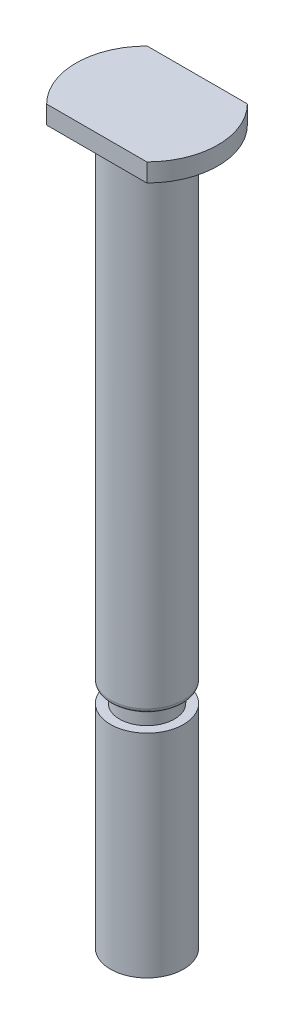
ISO-10303-21;
HEADER;
FILE_DESCRIPTION(('STEP AP214'),'2;1');
FILE_NAME('part.step','',(''),(''),'','','');
FILE_SCHEMA(('AUTOMOTIVE_DESIGN { 1 0 10303 214 1 1 1 1 }'));
ENDSEC;
DATA;
#1=APPLICATION_CONTEXT('core data for automotive mechanical design processes');
#2=APPLICATION_PROTOCOL_DEFINITION('international standard','automotive_design',2000,#1);
#3=PRODUCT_CONTEXT('',#1,'mechanical');
#4=PRODUCT('Part','Part','',(#3));
#5=PRODUCT_RELATED_PRODUCT_CATEGORY('part','',(#4));
#6=PRODUCT_DEFINITION_FORMATION('','',#4);
#7=PRODUCT_DEFINITION_CONTEXT('part definition',#1,'design');
#8=PRODUCT_DEFINITION('design','',#6,#7);
#9=PRODUCT_DEFINITION_SHAPE('','',#8);
#10=(LENGTH_UNIT() NAMED_UNIT(*) SI_UNIT(.MILLI.,.METRE.));
#11=(NAMED_UNIT(*) PLANE_ANGLE_UNIT() SI_UNIT($,.RADIAN.));
#12=(NAMED_UNIT(*) SI_UNIT($,.STERADIAN.) SOLID_ANGLE_UNIT());
#13=UNCERTAINTY_MEASURE_WITH_UNIT(LENGTH_MEASURE(1.E-05),#10,'distance_accuracy_value','');
#14=(GEOMETRIC_REPRESENTATION_CONTEXT(3) GLOBAL_UNCERTAINTY_ASSIGNED_CONTEXT((#13)) GLOBAL_UNIT_ASSIGNED_CONTEXT((#10,
#11,#12)) REPRESENTATION_CONTEXT('',''));
#15=CARTESIAN_POINT('',(0.,0.,0.));
#16=DIRECTION('',(0.,0.,1.));
#17=DIRECTION('',(1.,0.,0.));
#18=AXIS2_PLACEMENT_3D('',#15,#16,#17);
#19=CARTESIAN_POINT('',(0.,160.927319620624,6.));
#20=DIRECTION('',(0.,-1.,0.));
#21=DIRECTION('',(1.,0.,0.));
#22=AXIS2_PLACEMENT_3D('',#19,#20,#21);
#23=CYLINDRICAL_SURFACE('',#22,3.);
#24=DIRECTION('',(0.,1.,0.));
#25=VECTOR('',#24,1.);
#26=CARTESIAN_POINT('',(-3.,160.927319620624,6.));
#27=LINE('',#26,#25);
#28=CARTESIAN_POINT('',(-3.,171.627319620624,6.));
#29=VERTEX_POINT('',#28);
#30=CARTESIAN_POINT('',(-3.,172.927319620624,6.));
#31=VERTEX_POINT('',#30);
#32=EDGE_CURVE('E45',#29,#31,#27,.T.);
#33=ORIENTED_EDGE('',*,*,#32,.F.);
#34=CARTESIAN_POINT('',(0.,171.627319620624,6.));
#35=DIRECTION('',(0.,-1.,0.));
#36=DIRECTION('',(0.,0.,-1.));
#37=AXIS2_PLACEMENT_3D('',#34,#35,#36);
#38=CIRCLE('',#37,3.);
#39=EDGE_CURVE('E40',#29,#29,#38,.F.);
#40=ORIENTED_EDGE('',*,*,#39,.T.);
#41=ORIENTED_EDGE('',*,*,#32,.T.);
#42=CARTESIAN_POINT('',(0.,172.927319620624,6.));
#43=DIRECTION('',(0.,-1.,0.));
#44=DIRECTION('',(0.,0.,-1.));
#45=AXIS2_PLACEMENT_3D('',#42,#43,#44);
#46=CIRCLE('',#45,3.);
#47=CARTESIAN_POINT('',(3.,172.927319620624,6.));
#48=VERTEX_POINT('',#47);
#49=EDGE_CURVE('E133',#31,#48,#46,.T.);
#50=ORIENTED_EDGE('',*,*,#49,.T.);
#51=CARTESIAN_POINT('',(0.,172.927319620624,6.));
#52=DIRECTION('',(0.,-1.,0.));
#53=DIRECTION('',(0.,0.,-1.));
#54=AXIS2_PLACEMENT_3D('',#51,#52,#53);
#55=CIRCLE('',#54,3.);
#56=EDGE_CURVE('E131',#48,#31,#55,.T.);
#57=ORIENTED_EDGE('',*,*,#56,.T.);
#58=EDGE_LOOP('',(#33,#40,#41,#50,#57));
#59=FACE_BOUND('',#58,.T.);
#60=ADVANCED_FACE('F36',(#59),#23,.T.);
#61=CARTESIAN_POINT('',(0.,200.177319620624,6.));
#62=DIRECTION('',(0.,-1.,0.));
#63=DIRECTION('',(1.,0.,0.));
#64=AXIS2_PLACEMENT_3D('',#61,#62,#63);
#65=CYLINDRICAL_SURFACE('',#64,4.);
#66=CARTESIAN_POINT('',(0.,173.927319620624,6.));
#67=DIRECTION('',(0.,-1.,0.));
#68=DIRECTION('',(0.,0.,-1.));
#69=AXIS2_PLACEMENT_3D('',#66,#67,#68);
#70=CIRCLE('',#69,4.);
#71=CARTESIAN_POINT('',(4.,173.927319620624,6.));
#72=VERTEX_POINT('',#71);
#73=CARTESIAN_POINT('',(-4.,173.927319620624,6.));
#74=VERTEX_POINT('',#73);
#75=EDGE_CURVE('E142',#72,#74,#70,.T.);
#76=ORIENTED_EDGE('',*,*,#75,.F.);
#77=CARTESIAN_POINT('',(0.,173.927319620624,6.));
#78=DIRECTION('',(0.,-1.,0.));
#79=DIRECTION('',(0.,0.,-1.));
#80=AXIS2_PLACEMENT_3D('',#77,#78,#79);
#81=CIRCLE('',#80,4.);
#82=EDGE_CURVE('E151',#74,#72,#81,.T.);
#83=ORIENTED_EDGE('',*,*,#82,.F.);
#84=DIRECTION('',(0.,1.,0.));
#85=VECTOR('',#84,1.);
#86=CARTESIAN_POINT('',(-4.,200.177319620624,6.));
#87=LINE('',#86,#85);
#88=CARTESIAN_POINT('',(-4.,226.427319620624,6.));
#89=VERTEX_POINT('',#88);
#90=EDGE_CURVE('E11',#74,#89,#87,.T.);
#91=ORIENTED_EDGE('',*,*,#90,.T.);
#92=CARTESIAN_POINT('',(0.,226.427319620624,6.));
#93=DIRECTION('',(0.,-1.,0.));
#94=DIRECTION('',(0.,0.,-1.));
#95=AXIS2_PLACEMENT_3D('',#92,#93,#94);
#96=CIRCLE('',#95,4.);
#97=EDGE_CURVE('E145',#89,#89,#96,.T.);
#98=ORIENTED_EDGE('',*,*,#97,.T.);
#99=ORIENTED_EDGE('',*,*,#90,.F.);
#100=EDGE_LOOP('',(#76,#83,#91,#98,#99));
#101=FACE_BOUND('',#100,.T.);
#102=ADVANCED_FACE('F38',(#101),#65,.T.);
#103=CARTESIAN_POINT('',(0.,172.927319620624,6.));
#104=DIRECTION('',(0.,-1.,0.));
#105=DIRECTION('',(-1.,0.,0.));
#106=AXIS2_PLACEMENT_3D('',#103,#104,#105);
#107=TOROIDAL_SURFACE('',#106,3.5,0.499999999999994);
#108=CARTESIAN_POINT('',(0.,173.427319620624,6.));
#109=DIRECTION('',(0.,-1.,0.));
#110=DIRECTION('',(0.,0.,-1.));
#111=AXIS2_PLACEMENT_3D('',#108,#109,#110);
#112=CIRCLE('',#111,3.5);
#113=CARTESIAN_POINT('',(3.5,173.427319620624,6.));
#114=VERTEX_POINT('',#113);
#115=EDGE_CURVE('E129',#114,#114,#112,.T.);
#116=ORIENTED_EDGE('',*,*,#115,.T.);
#117=CARTESIAN_POINT('',(3.5,172.927319620624,6.));
#118=DIRECTION('',(0.,0.,1.));
#119=DIRECTION('',(1.,0.,0.));
#120=AXIS2_PLACEMENT_3D('',#117,#118,#119);
#121=CIRCLE('',#120,0.499999999999994);
#122=EDGE_CURVE('E152',#114,#48,#121,.T.);
#123=ORIENTED_EDGE('',*,*,#122,.T.);
#124=ORIENTED_EDGE('',*,*,#49,.F.);
#125=ORIENTED_EDGE('',*,*,#56,.F.);
#126=ORIENTED_EDGE('',*,*,#122,.F.);
#127=EDGE_LOOP('',(#116,#123,#124,#125,#126));
#128=FACE_BOUND('',#127,.T.);
#129=ADVANCED_FACE('F187',(#128),#107,.F.);
#130=CARTESIAN_POINT('',(0.,173.927319620624,6.));
#131=DIRECTION('',(0.,-1.,0.));
#132=DIRECTION('',(-1.,0.,0.));
#133=AXIS2_PLACEMENT_3D('',#130,#131,#132);
#134=TOROIDAL_SURFACE('',#133,3.5,0.5);
#135=ORIENTED_EDGE('',*,*,#115,.F.);
#136=CARTESIAN_POINT('',(3.5,173.927319620624,6.));
#137=DIRECTION('',(0.,0.,1.));
#138=DIRECTION('',(1.,0.,0.));
#139=AXIS2_PLACEMENT_3D('',#136,#137,#138);
#140=CIRCLE('',#139,0.5);
#141=EDGE_CURVE('E139',#114,#72,#140,.T.);
#142=ORIENTED_EDGE('',*,*,#141,.T.);
#143=ORIENTED_EDGE('',*,*,#75,.T.);
#144=ORIENTED_EDGE('',*,*,#82,.T.);
#145=ORIENTED_EDGE('',*,*,#141,.F.);
#146=EDGE_LOOP('',(#135,#142,#143,#144,#145));
#147=FACE_BOUND('',#146,.T.);
#148=ADVANCED_FACE('F196',(#147),#134,.T.);
#149=CARTESIAN_POINT('',(0.,228.427319620624,6.));
#150=DIRECTION('',(0.,1.,0.));
#151=DIRECTION('',(1.,0.,0.));
#152=AXIS2_PLACEMENT_3D('',#149,#150,#151);
#153=PLANE('',#152);
#154=DIRECTION('',(-1.,0.,0.));
#155=VECTOR('',#154,1.);
#156=CARTESIAN_POINT('',(5.48143418772513,228.427319620624,0.5));
#157=LINE('',#156,#155);
#158=CARTESIAN_POINT('',(5.48143418772513,228.427319620624,0.5));
#159=VERTEX_POINT('',#158);
#160=CARTESIAN_POINT('',(-5.48143418772514,228.427319620624,0.5));
#161=VERTEX_POINT('',#160);
#162=EDGE_CURVE('E127',#159,#161,#157,.T.);
#163=ORIENTED_EDGE('',*,*,#162,.T.);
#164=CARTESIAN_POINT('',(0.,228.427319620624,6.));
#165=DIRECTION('',(0.,1.,0.));
#166=DIRECTION('',(-0.705910298995404,0.,-0.708301242249524));
#167=AXIS2_PLACEMENT_3D('',#164,#165,#166);
#168=CIRCLE('',#167,7.76505767875306);
#169=CARTESIAN_POINT('',(-5.48143418772514,228.427319620624,11.5));
#170=VERTEX_POINT('',#169);
#171=EDGE_CURVE('E137',#161,#170,#168,.T.);
#172=ORIENTED_EDGE('',*,*,#171,.T.);
#173=DIRECTION('',(1.,0.,0.));
#174=VECTOR('',#173,1.);
#175=CARTESIAN_POINT('',(-5.48143418772514,228.427319620624,11.5));
#176=LINE('',#175,#174);
#177=CARTESIAN_POINT('',(5.48143418772513,228.427319620624,11.5));
#178=VERTEX_POINT('',#177);
#179=EDGE_CURVE('E109',#170,#178,#176,.T.);
#180=ORIENTED_EDGE('',*,*,#179,.T.);
#181=CARTESIAN_POINT('',(0.,228.427319620624,6.));
#182=DIRECTION('',(0.,1.,0.));
#183=DIRECTION('',(0.705910298995404,0.,0.708301242249524));
#184=AXIS2_PLACEMENT_3D('',#181,#182,#183);
#185=CIRCLE('',#184,7.76505767875306);
#186=EDGE_CURVE('E106',#178,#159,#185,.T.);
#187=ORIENTED_EDGE('',*,*,#186,.T.);
#188=EDGE_LOOP('',(#163,#172,#180,#187));
#189=FACE_BOUND('',#188,.T.);
#190=ADVANCED_FACE('F169',(#189),#153,.T.);
#191=CARTESIAN_POINT('',(5.48143418772513,226.427319620624,0.5));
#192=DIRECTION('',(0.,0.,-1.));
#193=DIRECTION('',(-1.,0.,0.));
#194=AXIS2_PLACEMENT_3D('',#191,#192,#193);
#195=PLANE('',#194);
#196=DIRECTION('',(-1.,0.,0.));
#197=VECTOR('',#196,1.);
#198=CARTESIAN_POINT('',(5.48143418772513,226.427319620624,0.5));
#199=LINE('',#198,#197);
#200=CARTESIAN_POINT('',(5.48143418772513,226.427319620624,0.5));
#201=VERTEX_POINT('',#200);
#202=CARTESIAN_POINT('',(-5.48143418772514,226.427319620624,0.5));
#203=VERTEX_POINT('',#202);
#204=EDGE_CURVE('E123',#201,#203,#199,.T.);
#205=ORIENTED_EDGE('',*,*,#204,.T.);
#206=DIRECTION('',(0.,1.,0.));
#207=VECTOR('',#206,1.);
#208=CARTESIAN_POINT('',(-5.48143418772514,226.427319620624,0.5));
#209=LINE('',#208,#207);
#210=EDGE_CURVE('E130',#203,#161,#209,.T.);
#211=ORIENTED_EDGE('',*,*,#210,.T.);
#212=ORIENTED_EDGE('',*,*,#162,.F.);
#213=DIRECTION('',(0.,1.,0.));
#214=VECTOR('',#213,1.);
#215=CARTESIAN_POINT('',(5.48143418772513,226.427319620624,0.5));
#216=LINE('',#215,#214);
#217=EDGE_CURVE('E147',#201,#159,#216,.T.);
#218=ORIENTED_EDGE('',*,*,#217,.F.);
#219=EDGE_LOOP('',(#205,#211,#212,#218));
#220=FACE_BOUND('',#219,.T.);
#221=ADVANCED_FACE('F166',(#220),#195,.T.);
#222=CARTESIAN_POINT('',(0.,226.427319620624,6.));
#223=DIRECTION('',(0.,1.,0.));
#224=DIRECTION('',(-0.705910298995404,0.,-0.708301242249524));
#225=AXIS2_PLACEMENT_3D('',#222,#223,#224);
#226=CYLINDRICAL_SURFACE('',#225,7.76505767875306);
#227=CARTESIAN_POINT('',(0.,226.427319620624,6.));
#228=DIRECTION('',(0.,1.,0.));
#229=DIRECTION('',(-0.705910298995404,0.,-0.708301242249524));
#230=AXIS2_PLACEMENT_3D('',#227,#228,#229);
#231=CIRCLE('',#230,7.76505767875306);
#232=CARTESIAN_POINT('',(-5.48143418772514,226.427319620624,11.5));
#233=VERTEX_POINT('',#232);
#234=EDGE_CURVE('E119',#203,#233,#231,.T.);
#235=ORIENTED_EDGE('',*,*,#234,.T.);
#236=DIRECTION('',(0.,1.,0.));
#237=VECTOR('',#236,1.);
#238=CARTESIAN_POINT('',(-5.48143418772514,226.427319620624,11.5));
#239=LINE('',#238,#237);
#240=EDGE_CURVE('E115',#233,#170,#239,.T.);
#241=ORIENTED_EDGE('',*,*,#240,.T.);
#242=ORIENTED_EDGE('',*,*,#171,.F.);
#243=ORIENTED_EDGE('',*,*,#210,.F.);
#244=EDGE_LOOP('',(#235,#241,#242,#243));
#245=FACE_BOUND('',#244,.T.);
#246=ADVANCED_FACE('F171',(#245),#226,.T.);
#247=CARTESIAN_POINT('',(-5.48143418772514,226.427319620624,11.5));
#248=DIRECTION('',(0.,0.,1.));
#249=DIRECTION('',(-1.,0.,0.));
#250=AXIS2_PLACEMENT_3D('',#247,#248,#249);
#251=PLANE('',#250);
#252=DIRECTION('',(1.,0.,0.));
#253=VECTOR('',#252,1.);
#254=CARTESIAN_POINT('',(-5.48143418772514,226.427319620624,11.5));
#255=LINE('',#254,#253);
#256=CARTESIAN_POINT('',(5.48143418772513,226.427319620624,11.5));
#257=VERTEX_POINT('',#256);
#258=EDGE_CURVE('E112',#233,#257,#255,.T.);
#259=ORIENTED_EDGE('',*,*,#258,.T.);
#260=DIRECTION('',(0.,1.,0.));
#261=VECTOR('',#260,1.);
#262=CARTESIAN_POINT('',(5.48143418772513,226.427319620624,11.5));
#263=LINE('',#262,#261);
#264=EDGE_CURVE('E98',#257,#178,#263,.T.);
#265=ORIENTED_EDGE('',*,*,#264,.T.);
#266=ORIENTED_EDGE('',*,*,#179,.F.);
#267=ORIENTED_EDGE('',*,*,#240,.F.);
#268=EDGE_LOOP('',(#259,#265,#266,#267));
#269=FACE_BOUND('',#268,.T.);
#270=ADVANCED_FACE('F113',(#269),#251,.T.);
#271=CARTESIAN_POINT('',(0.,226.427319620624,6.));
#272=DIRECTION('',(0.,1.,0.));
#273=DIRECTION('',(0.705910298995404,0.,0.708301242249524));
#274=AXIS2_PLACEMENT_3D('',#271,#272,#273);
#275=CYLINDRICAL_SURFACE('',#274,7.76505767875306);
#276=CARTESIAN_POINT('',(0.,226.427319620624,6.));
#277=DIRECTION('',(0.,1.,0.));
#278=DIRECTION('',(0.705910298995404,0.,0.708301242249524));
#279=AXIS2_PLACEMENT_3D('',#276,#277,#278);
#280=CIRCLE('',#279,7.76505767875306);
#281=EDGE_CURVE('E103',#257,#201,#280,.T.);
#282=ORIENTED_EDGE('',*,*,#281,.T.);
#283=ORIENTED_EDGE('',*,*,#217,.T.);
#284=ORIENTED_EDGE('',*,*,#186,.F.);
#285=ORIENTED_EDGE('',*,*,#264,.F.);
#286=EDGE_LOOP('',(#282,#283,#284,#285));
#287=FACE_BOUND('',#286,.T.);
#288=ADVANCED_FACE('F100',(#287),#275,.T.);
#289=CARTESIAN_POINT('',(0.,226.427319620624,6.));
#290=DIRECTION('',(0.,1.,0.));
#291=DIRECTION('',(1.,0.,0.));
#292=AXIS2_PLACEMENT_3D('',#289,#290,#291);
#293=PLANE('',#292);
#294=ORIENTED_EDGE('',*,*,#97,.F.);
#295=EDGE_LOOP('',(#294));
#296=FACE_BOUND('',#295,.T.);
#297=ORIENTED_EDGE('',*,*,#204,.F.);
#298=ORIENTED_EDGE('',*,*,#281,.F.);
#299=ORIENTED_EDGE('',*,*,#258,.F.);
#300=ORIENTED_EDGE('',*,*,#234,.F.);
#301=EDGE_LOOP('',(#297,#298,#299,#300));
#302=FACE_BOUND('',#301,.T.);
#303=ADVANCED_FACE('F121',(#296,#302),#293,.F.);
#304=CARTESIAN_POINT('',(0.,171.627319620624,6.));
#305=DIRECTION('',(0.,-1.,0.));
#306=DIRECTION('',(0.,0.,-1.));
#307=AXIS2_PLACEMENT_3D('',#304,#305,#306);
#308=CYLINDRICAL_SURFACE('',#307,4.);
#309=CARTESIAN_POINT('',(0.,171.627319620624,6.));
#310=DIRECTION('',(0.,-1.,0.));
#311=DIRECTION('',(0.,0.,-1.));
#312=AXIS2_PLACEMENT_3D('',#309,#310,#311);
#313=CIRCLE('',#312,4.);
#314=CARTESIAN_POINT('',(0.,171.627319620624,2.));
#315=VERTEX_POINT('',#314);
#316=EDGE_CURVE('E326',#315,#315,#313,.T.);
#317=ORIENTED_EDGE('',*,*,#316,.T.);
#318=EDGE_LOOP('',(#317));
#319=FACE_BOUND('',#318,.T.);
#320=CARTESIAN_POINT('',(0.,148.427319620624,6.));
#321=DIRECTION('',(0.,-1.,0.));
#322=DIRECTION('',(0.,0.,-1.));
#323=AXIS2_PLACEMENT_3D('',#320,#321,#322);
#324=CIRCLE('',#323,4.);
#325=CARTESIAN_POINT('',(0.,148.427319620624,2.));
#326=VERTEX_POINT('',#325);
#327=EDGE_CURVE('E161',#326,#326,#324,.T.);
#328=ORIENTED_EDGE('',*,*,#327,.F.);
#329=EDGE_LOOP('',(#328));
#330=FACE_BOUND('',#329,.T.);
#331=ADVANCED_FACE('F207',(#319,#330),#308,.T.);
#332=CARTESIAN_POINT('',(0.,171.627319620624,6.));
#333=DIRECTION('',(0.,-1.,0.));
#334=DIRECTION('',(0.,0.,-1.));
#335=AXIS2_PLACEMENT_3D('',#332,#333,#334);
#336=PLANE('',#335);
#337=ORIENTED_EDGE('',*,*,#39,.F.);
#338=EDGE_LOOP('',(#337));
#339=FACE_BOUND('',#338,.T.);
#340=ORIENTED_EDGE('',*,*,#316,.F.);
#341=EDGE_LOOP('',(#340));
#342=FACE_BOUND('',#341,.T.);
#343=ADVANCED_FACE('F193',(#339,#342),#336,.F.);
#344=CARTESIAN_POINT('',(0.,148.427319620624,6.));
#345=DIRECTION('',(0.,-1.,0.));
#346=DIRECTION('',(0.,0.,-1.));
#347=AXIS2_PLACEMENT_3D('',#344,#345,#346);
#348=PLANE('',#347);
#349=ORIENTED_EDGE('',*,*,#327,.T.);
#350=EDGE_LOOP('',(#349));
#351=FACE_BOUND('',#350,.T.);
#352=ADVANCED_FACE('F191',(#351),#348,.T.);
#353=CLOSED_SHELL('',(#60,#102,#129,#148,#190,#221,#246,#270,#288,#303,#331,#343,#352));
#354=MANIFOLD_SOLID_BREP('B2',#353);
#355=ADVANCED_BREP_SHAPE_REPRESENTATION('',(#18,#354),#14);
#356=SHAPE_DEFINITION_REPRESENTATION(#9,#355);
ENDSEC;
END-ISO-10303-21;
